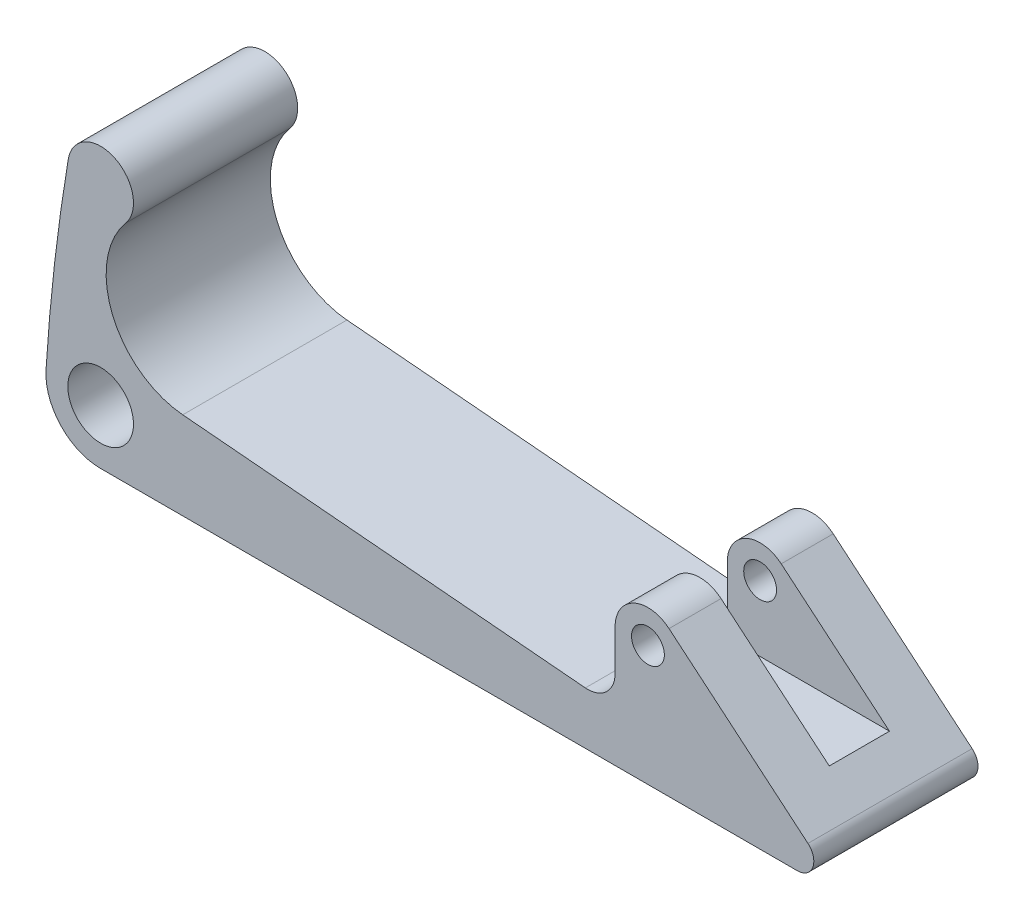
ISO-10303-21;
HEADER;
FILE_DESCRIPTION(('STEP AP214'),'2;1');
FILE_NAME('part.step','',(''),(''),'','','');
FILE_SCHEMA(('AUTOMOTIVE_DESIGN { 1 0 10303 214 1 1 1 1 }'));
ENDSEC;
DATA;
#1=APPLICATION_CONTEXT('core data for automotive mechanical design processes');
#2=APPLICATION_PROTOCOL_DEFINITION('international standard','automotive_design',2000,#1);
#3=PRODUCT_CONTEXT('',#1,'mechanical');
#4=PRODUCT('Part','Part','',(#3));
#5=PRODUCT_RELATED_PRODUCT_CATEGORY('part','',(#4));
#6=PRODUCT_DEFINITION_FORMATION('','',#4);
#7=PRODUCT_DEFINITION_CONTEXT('part definition',#1,'design');
#8=PRODUCT_DEFINITION('design','',#6,#7);
#9=PRODUCT_DEFINITION_SHAPE('','',#8);
#10=(LENGTH_UNIT() NAMED_UNIT(*) SI_UNIT(.MILLI.,.METRE.));
#11=(NAMED_UNIT(*) PLANE_ANGLE_UNIT() SI_UNIT($,.RADIAN.));
#12=(NAMED_UNIT(*) SI_UNIT($,.STERADIAN.) SOLID_ANGLE_UNIT());
#13=UNCERTAINTY_MEASURE_WITH_UNIT(LENGTH_MEASURE(1.E-05),#10,'distance_accuracy_value','');
#14=(GEOMETRIC_REPRESENTATION_CONTEXT(3) GLOBAL_UNCERTAINTY_ASSIGNED_CONTEXT((#13)) GLOBAL_UNIT_ASSIGNED_CONTEXT((#10,
#11,#12)) REPRESENTATION_CONTEXT('',''));
#15=CARTESIAN_POINT('',(0.,0.,0.));
#16=DIRECTION('',(0.,0.,1.));
#17=DIRECTION('',(1.,0.,0.));
#18=AXIS2_PLACEMENT_3D('',#15,#16,#17);
#19=CARTESIAN_POINT('',(64.6194262844656,-2.35093333532153,7.5));
#20=DIRECTION('',(-0.642787609686535,-0.766044443118982,0.));
#21=DIRECTION('',(0.766044443118982,-0.642787609686535,0.));
#22=AXIS2_PLACEMENT_3D('',#19,#20,#21);
#23=PLANE('',#22);
#24=DIRECTION('',(-0.766044443118982,0.642787609686535,0.));
#25=VECTOR('',#24,1.);
#26=CARTESIAN_POINT('',(41.4326190039493,17.1051081019381,2.75));
#27=LINE('',#26,#25);
#28=CARTESIAN_POINT('',(61.8176930361466,0.,2.75));
#29=VERTEX_POINT('',#28);
#30=CARTESIAN_POINT('',(51.9283628290596,8.29813332935695,2.75));
#31=VERTEX_POINT('',#30);
#32=EDGE_CURVE('E284',#29,#31,#27,.T.);
#33=ORIENTED_EDGE('',*,*,#32,.T.);
#34=DIRECTION('',(0.,0.,-1.));
#35=VECTOR('',#34,1.);
#36=CARTESIAN_POINT('',(51.9283628290596,8.29813332935695,7.5));
#37=LINE('',#36,#35);
#38=CARTESIAN_POINT('',(51.9283628290596,8.29813332935695,7.5));
#39=VERTEX_POINT('',#38);
#40=EDGE_CURVE('E200',#39,#31,#37,.T.);
#41=ORIENTED_EDGE('',*,*,#40,.F.);
#42=DIRECTION('',(-0.766044443118982,0.642787609686535,0.));
#43=VECTOR('',#42,1.);
#44=CARTESIAN_POINT('',(64.6194262844656,-2.35093333532153,7.5));
#45=LINE('',#44,#43);
#46=CARTESIAN_POINT('',(64.6194262844656,-2.35093333532153,7.5));
#47=VERTEX_POINT('',#46);
#48=EDGE_CURVE('E231',#47,#39,#45,.T.);
#49=ORIENTED_EDGE('',*,*,#48,.F.);
#50=DIRECTION('',(0.,0.,-1.));
#51=VECTOR('',#50,1.);
#52=CARTESIAN_POINT('',(64.6194262844656,-2.35093333532153,7.5));
#53=LINE('',#52,#51);
#54=CARTESIAN_POINT('',(64.6194262844656,-2.35093333532153,-7.5));
#55=VERTEX_POINT('',#54);
#56=EDGE_CURVE('E203',#47,#55,#53,.T.);
#57=ORIENTED_EDGE('',*,*,#56,.T.);
#58=DIRECTION('',(-0.766044443118982,0.642787609686535,0.));
#59=VECTOR('',#58,1.);
#60=CARTESIAN_POINT('',(64.6194262844656,-2.35093333532153,-7.5));
#61=LINE('',#60,#59);
#62=CARTESIAN_POINT('',(51.9283628290596,8.29813332935695,-7.5));
#63=VERTEX_POINT('',#62);
#64=EDGE_CURVE('E172',#55,#63,#61,.T.);
#65=ORIENTED_EDGE('',*,*,#64,.T.);
#66=CARTESIAN_POINT('',(51.9283628290596,8.29813332935695,-2.75));
#67=VERTEX_POINT('',#66);
#68=EDGE_CURVE('E199',#67,#63,#37,.T.);
#69=ORIENTED_EDGE('',*,*,#68,.F.);
#70=DIRECTION('',(-0.766044443118982,0.642787609686535,0.));
#71=VECTOR('',#70,1.);
#72=CARTESIAN_POINT('',(41.4326190039493,17.1051081019381,-2.75));
#73=LINE('',#72,#71);
#74=CARTESIAN_POINT('',(61.8176930361466,0.,-2.75));
#75=VERTEX_POINT('',#74);
#76=EDGE_CURVE('E301',#75,#67,#73,.T.);
#77=ORIENTED_EDGE('',*,*,#76,.F.);
#78=DIRECTION('',(0.,0.,1.));
#79=VECTOR('',#78,1.);
#80=CARTESIAN_POINT('',(61.8176930361466,0.,0.));
#81=LINE('',#80,#79);
#82=EDGE_CURVE('E280',#75,#29,#81,.T.);
#83=ORIENTED_EDGE('',*,*,#82,.T.);
#84=EDGE_LOOP('',(#33,#41,#49,#57,#65,#69,#77,#83));
#85=FACE_BOUND('',#84,.T.);
#86=ADVANCED_FACE('F35',(#85),#23,.F.);
#87=CARTESIAN_POINT('',(50.,6.,7.5));
#88=DIRECTION('',(0.,0.,-1.));
#89=DIRECTION('',(-1.,0.,0.));
#90=AXIS2_PLACEMENT_3D('',#87,#88,#89);
#91=CYLINDRICAL_SURFACE('',#90,3.);
#92=CARTESIAN_POINT('',(50.,6.,2.75));
#93=DIRECTION('',(0.,0.,-1.));
#94=DIRECTION('',(-1.,0.,0.));
#95=AXIS2_PLACEMENT_3D('',#92,#93,#94);
#96=CIRCLE('',#95,3.);
#97=CARTESIAN_POINT('',(47.,6.,2.75));
#98=VERTEX_POINT('',#97);
#99=EDGE_CURVE('E294',#31,#98,#96,.F.);
#100=ORIENTED_EDGE('',*,*,#99,.T.);
#101=DIRECTION('',(0.,0.,-1.));
#102=VECTOR('',#101,1.);
#103=CARTESIAN_POINT('',(47.,6.,7.5));
#104=LINE('',#103,#102);
#105=CARTESIAN_POINT('',(47.,6.,7.5));
#106=VERTEX_POINT('',#105);
#107=EDGE_CURVE('E196',#106,#98,#104,.T.);
#108=ORIENTED_EDGE('',*,*,#107,.F.);
#109=CARTESIAN_POINT('',(50.,6.,7.5));
#110=DIRECTION('',(0.,0.,1.));
#111=DIRECTION('',(1.,0.,0.));
#112=AXIS2_PLACEMENT_3D('',#109,#110,#111);
#113=CIRCLE('',#112,3.);
#114=EDGE_CURVE('E233',#39,#106,#113,.T.);
#115=ORIENTED_EDGE('',*,*,#114,.F.);
#116=ORIENTED_EDGE('',*,*,#40,.T.);
#117=EDGE_LOOP('',(#100,#108,#115,#116));
#118=FACE_BOUND('',#117,.T.);
#119=ADVANCED_FACE('F331',(#118),#91,.T.);
#120=CARTESIAN_POINT('',(47.,6.,7.5));
#121=DIRECTION('',(1.,0.,0.));
#122=DIRECTION('',(0.,1.,0.));
#123=AXIS2_PLACEMENT_3D('',#120,#121,#122);
#124=PLANE('',#123);
#125=DIRECTION('',(0.,-1.,0.));
#126=VECTOR('',#125,1.);
#127=CARTESIAN_POINT('',(47.,20.501,2.75));
#128=LINE('',#127,#126);
#129=CARTESIAN_POINT('',(47.,2.27246904339944,2.75));
#130=VERTEX_POINT('',#129);
#131=EDGE_CURVE('E249',#98,#130,#128,.T.);
#132=ORIENTED_EDGE('',*,*,#131,.T.);
#133=DIRECTION('',(0.,0.,-1.));
#134=VECTOR('',#133,1.);
#135=CARTESIAN_POINT('',(47.,2.27246904339944,7.5));
#136=LINE('',#135,#134);
#137=CARTESIAN_POINT('',(47.,2.27246904339944,7.5));
#138=VERTEX_POINT('',#137);
#139=EDGE_CURVE('E192',#138,#130,#136,.T.);
#140=ORIENTED_EDGE('',*,*,#139,.F.);
#141=DIRECTION('',(0.,-1.,0.));
#142=VECTOR('',#141,1.);
#143=CARTESIAN_POINT('',(47.,6.,7.5));
#144=LINE('',#143,#142);
#145=EDGE_CURVE('E236',#106,#138,#144,.T.);
#146=ORIENTED_EDGE('',*,*,#145,.F.);
#147=ORIENTED_EDGE('',*,*,#107,.T.);
#148=EDGE_LOOP('',(#132,#140,#146,#147));
#149=FACE_BOUND('',#148,.T.);
#150=ADVANCED_FACE('F246',(#149),#124,.F.);
#151=CARTESIAN_POINT('',(44.5,2.27246904339944,7.5));
#152=DIRECTION('',(0.,0.,-1.));
#153=DIRECTION('',(-1.,0.,0.));
#154=AXIS2_PLACEMENT_3D('',#151,#152,#153);
#155=CYLINDRICAL_SURFACE('',#154,2.5);
#156=CARTESIAN_POINT('',(44.5,2.27246904339944,2.75));
#157=DIRECTION('',(0.,0.,-1.));
#158=DIRECTION('',(-1.,0.,0.));
#159=AXIS2_PLACEMENT_3D('',#156,#157,#158);
#160=CIRCLE('',#159,2.5);
#161=CARTESIAN_POINT('',(45.5420577943623,0.,2.75));
#162=VERTEX_POINT('',#161);
#163=EDGE_CURVE('E304',#130,#162,#160,.T.);
#164=ORIENTED_EDGE('',*,*,#163,.T.);
#165=DIRECTION('',(0.,0.,-1.));
#166=VECTOR('',#165,1.);
#167=CARTESIAN_POINT('',(45.5420577943623,0.,7.5));
#168=LINE('',#167,#166);
#169=CARTESIAN_POINT('',(45.5420577943623,0.,-2.75));
#170=VERTEX_POINT('',#169);
#171=EDGE_CURVE('E287',#162,#170,#168,.T.);
#172=ORIENTED_EDGE('',*,*,#171,.T.);
#173=CARTESIAN_POINT('',(44.5,2.27246904339944,-2.75));
#174=DIRECTION('',(0.,0.,-1.));
#175=DIRECTION('',(-1.,0.,0.));
#176=AXIS2_PLACEMENT_3D('',#173,#174,#175);
#177=CIRCLE('',#176,2.5);
#178=CARTESIAN_POINT('',(47.,2.27246904339944,-2.75));
#179=VERTEX_POINT('',#178);
#180=EDGE_CURVE('E306',#179,#170,#177,.T.);
#181=ORIENTED_EDGE('',*,*,#180,.F.);
#182=CARTESIAN_POINT('',(47.,2.27246904339944,-7.5));
#183=VERTEX_POINT('',#182);
#184=EDGE_CURVE('E191',#179,#183,#136,.T.);
#185=ORIENTED_EDGE('',*,*,#184,.T.);
#186=CARTESIAN_POINT('',(44.5,2.27246904339944,-7.5));
#187=DIRECTION('',(0.,0.,-1.));
#188=DIRECTION('',(-1.,0.,0.));
#189=AXIS2_PLACEMENT_3D('',#186,#187,#188);
#190=CIRCLE('',#189,2.5);
#191=CARTESIAN_POINT('',(44.2821106431309,-0.21801770182993,-7.5));
#192=VERTEX_POINT('',#191);
#193=EDGE_CURVE('E181',#183,#192,#190,.T.);
#194=ORIENTED_EDGE('',*,*,#193,.T.);
#195=DIRECTION('',(0.,0.,-1.));
#196=VECTOR('',#195,1.);
#197=CARTESIAN_POINT('',(44.2821106431309,-0.21801770182993,7.5));
#198=LINE('',#197,#196);
#199=CARTESIAN_POINT('',(44.2821106431309,-0.21801770182993,7.5));
#200=VERTEX_POINT('',#199);
#201=EDGE_CURVE('E153',#200,#192,#198,.T.);
#202=ORIENTED_EDGE('',*,*,#201,.F.);
#203=CARTESIAN_POINT('',(44.5,2.27246904339944,7.5));
#204=DIRECTION('',(0.,0.,-1.));
#205=DIRECTION('',(-1.,0.,0.));
#206=AXIS2_PLACEMENT_3D('',#203,#204,#205);
#207=CIRCLE('',#206,2.5);
#208=EDGE_CURVE('E141',#138,#200,#207,.T.);
#209=ORIENTED_EDGE('',*,*,#208,.F.);
#210=ORIENTED_EDGE('',*,*,#139,.T.);
#211=EDGE_LOOP('',(#164,#172,#181,#185,#194,#202,#209,#210));
#212=FACE_BOUND('',#211,.T.);
#213=ADVANCED_FACE('F252',(#212),#155,.F.);
#214=CARTESIAN_POINT('',(50.,6.,7.5));
#215=DIRECTION('',(0.,0.,-1.));
#216=DIRECTION('',(-1.,0.,0.));
#217=AXIS2_PLACEMENT_3D('',#214,#215,#216);
#218=CYLINDRICAL_SURFACE('',#217,1.5);
#219=CARTESIAN_POINT('',(50.,6.,7.5));
#220=DIRECTION('',(0.,0.,1.));
#221=DIRECTION('',(1.,0.,0.));
#222=AXIS2_PLACEMENT_3D('',#219,#220,#221);
#223=CIRCLE('',#222,1.5);
#224=CARTESIAN_POINT('',(51.5,6.,7.5));
#225=VERTEX_POINT('',#224);
#226=EDGE_CURVE('E265',#225,#225,#223,.T.);
#227=ORIENTED_EDGE('',*,*,#226,.T.);
#228=EDGE_LOOP('',(#227));
#229=FACE_BOUND('',#228,.T.);
#230=CARTESIAN_POINT('',(50.,6.,2.75));
#231=DIRECTION('',(0.,0.,-1.));
#232=DIRECTION('',(-1.,0.,0.));
#233=AXIS2_PLACEMENT_3D('',#230,#231,#232);
#234=CIRCLE('',#233,1.5);
#235=CARTESIAN_POINT('',(48.5,6.,2.75));
#236=VERTEX_POINT('',#235);
#237=EDGE_CURVE('E271',#236,#236,#234,.F.);
#238=ORIENTED_EDGE('',*,*,#237,.F.);
#239=EDGE_LOOP('',(#238));
#240=FACE_BOUND('',#239,.T.);
#241=ADVANCED_FACE('F374',(#229,#240),#218,.F.);
#242=CARTESIAN_POINT('',(164.683096879914,-10.2214285714286,7.5));
#243=DIRECTION('',(0.,0.,-1.));
#244=DIRECTION('',(-1.,0.,0.));
#245=AXIS2_PLACEMENT_3D('',#242,#243,#244);
#246=PLANE('',#245);
#247=CARTESIAN_POINT('',(164.683096879914,-10.2214285714286,7.5));
#248=DIRECTION('',(0.,0.,1.));
#249=DIRECTION('',(-1.,0.,0.));
#250=AXIS2_PLACEMENT_3D('',#247,#248,#249);
#251=CIRCLE('',#250,170.);
#252=CARTESIAN_POINT('',(-2.95837898586672,17.9979897348161,7.5));
#253=VERTEX_POINT('',#252);
#254=CARTESIAN_POINT('',(-4.9903968751489,0.30974025974026,7.5));
#255=VERTEX_POINT('',#254);
#256=EDGE_CURVE('E187',#253,#255,#251,.T.);
#257=ORIENTED_EDGE('',*,*,#256,.T.);
#258=CARTESIAN_POINT('',(0.,0.,7.5));
#259=DIRECTION('',(0.,0.,1.));
#260=DIRECTION('',(-1.,0.,0.));
#261=AXIS2_PLACEMENT_3D('',#258,#259,#260);
#262=CIRCLE('',#261,4.99999999999999);
#263=CARTESIAN_POINT('',(0.,-5.,7.5));
#264=VERTEX_POINT('',#263);
#265=EDGE_CURVE('E109',#255,#264,#262,.T.);
#266=ORIENTED_EDGE('',*,*,#265,.T.);
#267=DIRECTION('',(1.,0.,0.));
#268=VECTOR('',#267,1.);
#269=CARTESIAN_POINT('',(0.,-5.,7.5));
#270=LINE('',#269,#268);
#271=CARTESIAN_POINT('',(63.6552448699358,-5.,7.5));
#272=VERTEX_POINT('',#271);
#273=EDGE_CURVE('E214',#264,#272,#270,.T.);
#274=ORIENTED_EDGE('',*,*,#273,.T.);
#275=CARTESIAN_POINT('',(63.6552448699358,-3.5,7.5));
#276=DIRECTION('',(0.,0.,1.));
#277=DIRECTION('',(1.,0.,0.));
#278=AXIS2_PLACEMENT_3D('',#275,#276,#277);
#279=CIRCLE('',#278,1.5);
#280=EDGE_CURVE('E234',#272,#47,#279,.T.);
#281=ORIENTED_EDGE('',*,*,#280,.T.);
#282=ORIENTED_EDGE('',*,*,#48,.T.);
#283=ORIENTED_EDGE('',*,*,#114,.T.);
#284=ORIENTED_EDGE('',*,*,#145,.T.);
#285=ORIENTED_EDGE('',*,*,#208,.T.);
#286=DIRECTION('',(-0.996194698091746,0.0871557427476513,0.));
#287=VECTOR('',#286,1.);
#288=CARTESIAN_POINT('',(44.2821106431309,-0.21801770182993,7.5));
#289=LINE('',#288,#287);
#290=CARTESIAN_POINT('',(7.5,3.,7.5));
#291=VERTEX_POINT('',#290);
#292=EDGE_CURVE('E133',#200,#291,#289,.T.);
#293=ORIENTED_EDGE('',*,*,#292,.T.);
#294=CARTESIAN_POINT('',(8.16828647845811,10.6385494020051,7.5));
#295=DIRECTION('',(0.,0.,-1.));
#296=DIRECTION('',(1.,0.,0.));
#297=AXIS2_PLACEMENT_3D('',#294,#295,#296);
#298=CIRCLE('',#297,7.66772741978754);
#299=CARTESIAN_POINT('',(2.29710213535456,15.5704089086676,7.5));
#300=VERTEX_POINT('',#299);
#301=EDGE_CURVE('E138',#291,#300,#298,.T.);
#302=ORIENTED_EDGE('',*,*,#301,.T.);
#303=CARTESIAN_POINT('',(0.,17.5,7.5));
#304=DIRECTION('',(0.,0.,1.));
#305=DIRECTION('',(-1.,0.,0.));
#306=AXIS2_PLACEMENT_3D('',#303,#304,#305);
#307=CIRCLE('',#306,2.99999999999999);
#308=EDGE_CURVE('E59',#300,#253,#307,.T.);
#309=ORIENTED_EDGE('',*,*,#308,.T.);
#310=EDGE_LOOP('',(#257,#266,#274,#281,#282,#283,#284,#285,#293,#302,#309));
#311=FACE_BOUND('',#310,.T.);
#312=CARTESIAN_POINT('',(0.,0.,7.5));
#313=DIRECTION('',(0.,0.,1.));
#314=DIRECTION('',(1.,0.,0.));
#315=AXIS2_PLACEMENT_3D('',#312,#313,#314);
#316=CIRCLE('',#315,3.);
#317=CARTESIAN_POINT('',(3.,0.,7.5));
#318=VERTEX_POINT('',#317);
#319=EDGE_CURVE('E166',#318,#318,#316,.T.);
#320=ORIENTED_EDGE('',*,*,#319,.F.);
#321=EDGE_LOOP('',(#320));
#322=FACE_BOUND('',#321,.T.);
#323=ORIENTED_EDGE('',*,*,#226,.F.);
#324=EDGE_LOOP('',(#323));
#325=FACE_BOUND('',#324,.T.);
#326=ADVANCED_FACE('F135',(#311,#322,#325),#246,.F.);
#327=CARTESIAN_POINT('',(164.683096879914,-10.2214285714286,-7.5));
#328=DIRECTION('',(0.,0.,-1.));
#329=DIRECTION('',(-1.,0.,0.));
#330=AXIS2_PLACEMENT_3D('',#327,#328,#329);
#331=PLANE('',#330);
#332=CARTESIAN_POINT('',(0.,0.,-7.5));
#333=DIRECTION('',(0.,0.,1.));
#334=DIRECTION('',(1.,0.,0.));
#335=AXIS2_PLACEMENT_3D('',#332,#333,#334);
#336=CIRCLE('',#335,3.);
#337=CARTESIAN_POINT('',(3.,0.,-7.5));
#338=VERTEX_POINT('',#337);
#339=EDGE_CURVE('E262',#338,#338,#336,.T.);
#340=ORIENTED_EDGE('',*,*,#339,.T.);
#341=EDGE_LOOP('',(#340));
#342=FACE_BOUND('',#341,.T.);
#343=CARTESIAN_POINT('',(164.683096879914,-10.2214285714286,-7.5));
#344=DIRECTION('',(0.,0.,1.));
#345=DIRECTION('',(-1.,0.,0.));
#346=AXIS2_PLACEMENT_3D('',#343,#344,#345);
#347=CIRCLE('',#346,170.);
#348=CARTESIAN_POINT('',(-2.95837898586672,17.9979897348161,-7.5));
#349=VERTEX_POINT('',#348);
#350=CARTESIAN_POINT('',(-4.9903968751489,0.30974025974026,-7.5));
#351=VERTEX_POINT('',#350);
#352=EDGE_CURVE('E162',#349,#351,#347,.T.);
#353=ORIENTED_EDGE('',*,*,#352,.F.);
#354=CARTESIAN_POINT('',(0.,17.5,-7.5));
#355=DIRECTION('',(0.,0.,1.));
#356=DIRECTION('',(-1.,0.,0.));
#357=AXIS2_PLACEMENT_3D('',#354,#355,#356);
#358=CIRCLE('',#357,2.99999999999999);
#359=CARTESIAN_POINT('',(2.29710213535456,15.5704089086676,-7.5));
#360=VERTEX_POINT('',#359);
#361=EDGE_CURVE('E101',#360,#349,#358,.T.);
#362=ORIENTED_EDGE('',*,*,#361,.F.);
#363=CARTESIAN_POINT('',(8.16828647845811,10.6385494020051,-7.5));
#364=DIRECTION('',(0.,0.,-1.));
#365=DIRECTION('',(1.,0.,0.));
#366=AXIS2_PLACEMENT_3D('',#363,#364,#365);
#367=CIRCLE('',#366,7.66772741978754);
#368=CARTESIAN_POINT('',(7.5,3.,-7.5));
#369=VERTEX_POINT('',#368);
#370=EDGE_CURVE('E184',#369,#360,#367,.T.);
#371=ORIENTED_EDGE('',*,*,#370,.F.);
#372=DIRECTION('',(-0.996194698091746,0.0871557427476513,0.));
#373=VECTOR('',#372,1.);
#374=CARTESIAN_POINT('',(44.2821106431309,-0.21801770182993,-7.5));
#375=LINE('',#374,#373);
#376=EDGE_CURVE('E150',#192,#369,#375,.T.);
#377=ORIENTED_EDGE('',*,*,#376,.F.);
#378=ORIENTED_EDGE('',*,*,#193,.F.);
#379=DIRECTION('',(0.,-1.,0.));
#380=VECTOR('',#379,1.);
#381=CARTESIAN_POINT('',(47.,6.,-7.5));
#382=LINE('',#381,#380);
#383=CARTESIAN_POINT('',(47.,6.,-7.5));
#384=VERTEX_POINT('',#383);
#385=EDGE_CURVE('E178',#384,#183,#382,.T.);
#386=ORIENTED_EDGE('',*,*,#385,.F.);
#387=CARTESIAN_POINT('',(50.,6.,-7.5));
#388=DIRECTION('',(0.,0.,1.));
#389=DIRECTION('',(1.,0.,0.));
#390=AXIS2_PLACEMENT_3D('',#387,#388,#389);
#391=CIRCLE('',#390,3.);
#392=EDGE_CURVE('E175',#63,#384,#391,.T.);
#393=ORIENTED_EDGE('',*,*,#392,.F.);
#394=ORIENTED_EDGE('',*,*,#64,.F.);
#395=CARTESIAN_POINT('',(63.6552448699358,-3.5,-7.5));
#396=DIRECTION('',(0.,0.,1.));
#397=DIRECTION('',(1.,0.,0.));
#398=AXIS2_PLACEMENT_3D('',#395,#396,#397);
#399=CIRCLE('',#398,1.5);
#400=CARTESIAN_POINT('',(63.6552448699358,-5.,-7.5));
#401=VERTEX_POINT('',#400);
#402=EDGE_CURVE('E170',#401,#55,#399,.T.);
#403=ORIENTED_EDGE('',*,*,#402,.F.);
#404=DIRECTION('',(1.,0.,0.));
#405=VECTOR('',#404,1.);
#406=CARTESIAN_POINT('',(0.,-5.,-7.5));
#407=LINE('',#406,#405);
#408=CARTESIAN_POINT('',(0.,-5.,-7.5));
#409=VERTEX_POINT('',#408);
#410=EDGE_CURVE('E168',#409,#401,#407,.T.);
#411=ORIENTED_EDGE('',*,*,#410,.F.);
#412=CARTESIAN_POINT('',(0.,0.,-7.5));
#413=DIRECTION('',(0.,0.,1.));
#414=DIRECTION('',(-1.,0.,0.));
#415=AXIS2_PLACEMENT_3D('',#412,#413,#414);
#416=CIRCLE('',#415,4.99999999999999);
#417=EDGE_CURVE('E165',#351,#409,#416,.T.);
#418=ORIENTED_EDGE('',*,*,#417,.F.);
#419=EDGE_LOOP('',(#353,#362,#371,#377,#378,#386,#393,#394,#403,#411,#418));
#420=FACE_BOUND('',#419,.T.);
#421=CARTESIAN_POINT('',(50.,6.,-7.5));
#422=DIRECTION('',(0.,0.,1.));
#423=DIRECTION('',(1.,0.,0.));
#424=AXIS2_PLACEMENT_3D('',#421,#422,#423);
#425=CIRCLE('',#424,1.5);
#426=CARTESIAN_POINT('',(51.5,6.,-7.5));
#427=VERTEX_POINT('',#426);
#428=EDGE_CURVE('E268',#427,#427,#425,.T.);
#429=ORIENTED_EDGE('',*,*,#428,.T.);
#430=EDGE_LOOP('',(#429));
#431=FACE_BOUND('',#430,.T.);
#432=ADVANCED_FACE('F218',(#342,#420,#431),#331,.T.);
#433=CARTESIAN_POINT('',(164.683096879914,-10.2214285714286,7.5));
#434=DIRECTION('',(0.,0.,-1.));
#435=DIRECTION('',(-1.,0.,0.));
#436=AXIS2_PLACEMENT_3D('',#433,#434,#435);
#437=CYLINDRICAL_SURFACE('',#436,170.);
#438=ORIENTED_EDGE('',*,*,#352,.T.);
#439=DIRECTION('',(0.,0.,-1.));
#440=VECTOR('',#439,1.);
#441=CARTESIAN_POINT('',(-4.9903968751489,0.30974025974026,7.5));
#442=LINE('',#441,#440);
#443=EDGE_CURVE('E11',#255,#351,#442,.T.);
#444=ORIENTED_EDGE('',*,*,#443,.F.);
#445=ORIENTED_EDGE('',*,*,#256,.F.);
#446=DIRECTION('',(0.,0.,-1.));
#447=VECTOR('',#446,1.);
#448=CARTESIAN_POINT('',(-2.95837898586672,17.9979897348161,7.5));
#449=LINE('',#448,#447);
#450=EDGE_CURVE('E158',#253,#349,#449,.T.);
#451=ORIENTED_EDGE('',*,*,#450,.T.);
#452=EDGE_LOOP('',(#438,#444,#445,#451));
#453=FACE_BOUND('',#452,.T.);
#454=ADVANCED_FACE('F37',(#453),#437,.T.);
#455=CARTESIAN_POINT('',(0.,0.,7.5));
#456=DIRECTION('',(0.,0.,-1.));
#457=DIRECTION('',(-1.,0.,0.));
#458=AXIS2_PLACEMENT_3D('',#455,#456,#457);
#459=CYLINDRICAL_SURFACE('',#458,4.99999999999999);
#460=ORIENTED_EDGE('',*,*,#417,.T.);
#461=DIRECTION('',(0.,0.,-1.));
#462=VECTOR('',#461,1.);
#463=CARTESIAN_POINT('',(0.,-5.,7.5));
#464=LINE('',#463,#462);
#465=EDGE_CURVE('E43',#264,#409,#464,.T.);
#466=ORIENTED_EDGE('',*,*,#465,.F.);
#467=ORIENTED_EDGE('',*,*,#265,.F.);
#468=ORIENTED_EDGE('',*,*,#443,.T.);
#469=EDGE_LOOP('',(#460,#466,#467,#468));
#470=FACE_BOUND('',#469,.T.);
#471=ADVANCED_FACE('F361',(#470),#459,.T.);
#472=CARTESIAN_POINT('',(0.,-5.,7.5));
#473=DIRECTION('',(0.,1.,0.));
#474=DIRECTION('',(-1.,0.,0.));
#475=AXIS2_PLACEMENT_3D('',#472,#473,#474);
#476=PLANE('',#475);
#477=ORIENTED_EDGE('',*,*,#410,.T.);
#478=DIRECTION('',(0.,0.,-1.));
#479=VECTOR('',#478,1.);
#480=CARTESIAN_POINT('',(63.6552448699358,-5.,7.5));
#481=LINE('',#480,#479);
#482=EDGE_CURVE('E206',#272,#401,#481,.T.);
#483=ORIENTED_EDGE('',*,*,#482,.F.);
#484=ORIENTED_EDGE('',*,*,#273,.F.);
#485=ORIENTED_EDGE('',*,*,#465,.T.);
#486=EDGE_LOOP('',(#477,#483,#484,#485));
#487=FACE_BOUND('',#486,.T.);
#488=ADVANCED_FACE('F212',(#487),#476,.F.);
#489=CARTESIAN_POINT('',(63.6552448699358,-3.5,7.5));
#490=DIRECTION('',(0.,0.,-1.));
#491=DIRECTION('',(-1.,0.,0.));
#492=AXIS2_PLACEMENT_3D('',#489,#490,#491);
#493=CYLINDRICAL_SURFACE('',#492,1.5);
#494=ORIENTED_EDGE('',*,*,#402,.T.);
#495=ORIENTED_EDGE('',*,*,#56,.F.);
#496=ORIENTED_EDGE('',*,*,#280,.F.);
#497=ORIENTED_EDGE('',*,*,#482,.T.);
#498=EDGE_LOOP('',(#494,#495,#496,#497));
#499=FACE_BOUND('',#498,.T.);
#500=ADVANCED_FACE('F224',(#499),#493,.T.);
#501=CARTESIAN_POINT('',(47.,6.,-2.75));
#502=VERTEX_POINT('',#501);
#503=EDGE_CURVE('E195',#502,#384,#104,.T.);
#504=ORIENTED_EDGE('',*,*,#503,.F.);
#505=CARTESIAN_POINT('',(50.,6.,-2.75));
#506=DIRECTION('',(0.,0.,-1.));
#507=DIRECTION('',(-1.,0.,0.));
#508=AXIS2_PLACEMENT_3D('',#505,#506,#507);
#509=CIRCLE('',#508,3.);
#510=EDGE_CURVE('E274',#67,#502,#509,.F.);
#511=ORIENTED_EDGE('',*,*,#510,.F.);
#512=ORIENTED_EDGE('',*,*,#68,.T.);
#513=ORIENTED_EDGE('',*,*,#392,.T.);
#514=EDGE_LOOP('',(#504,#511,#512,#513));
#515=FACE_BOUND('',#514,.T.);
#516=ADVANCED_FACE('F339',(#515),#91,.T.);
#517=ORIENTED_EDGE('',*,*,#184,.F.);
#518=DIRECTION('',(0.,-1.,0.));
#519=VECTOR('',#518,1.);
#520=CARTESIAN_POINT('',(47.,20.501,-2.75));
#521=LINE('',#520,#519);
#522=EDGE_CURVE('E277',#502,#179,#521,.T.);
#523=ORIENTED_EDGE('',*,*,#522,.F.);
#524=ORIENTED_EDGE('',*,*,#503,.T.);
#525=ORIENTED_EDGE('',*,*,#385,.T.);
#526=EDGE_LOOP('',(#517,#523,#524,#525));
#527=FACE_BOUND('',#526,.T.);
#528=ADVANCED_FACE('F341',(#527),#124,.F.);
#529=CARTESIAN_POINT('',(44.2821106431309,-0.21801770182993,7.5));
#530=DIRECTION('',(-0.0871557427476513,-0.996194698091746,0.));
#531=DIRECTION('',(0.996194698091746,-0.0871557427476513,0.));
#532=AXIS2_PLACEMENT_3D('',#529,#530,#531);
#533=PLANE('',#532);
#534=ORIENTED_EDGE('',*,*,#376,.T.);
#535=DIRECTION('',(0.,0.,-1.));
#536=VECTOR('',#535,1.);
#537=CARTESIAN_POINT('',(7.5,3.,7.5));
#538=LINE('',#537,#536);
#539=EDGE_CURVE('E147',#291,#369,#538,.T.);
#540=ORIENTED_EDGE('',*,*,#539,.F.);
#541=ORIENTED_EDGE('',*,*,#292,.F.);
#542=ORIENTED_EDGE('',*,*,#201,.T.);
#543=EDGE_LOOP('',(#534,#540,#541,#542));
#544=FACE_BOUND('',#543,.T.);
#545=ADVANCED_FACE('F148',(#544),#533,.F.);
#546=CARTESIAN_POINT('',(8.16828647845811,10.6385494020051,7.5));
#547=DIRECTION('',(0.,0.,-1.));
#548=DIRECTION('',(-1.,0.,0.));
#549=AXIS2_PLACEMENT_3D('',#546,#547,#548);
#550=CYLINDRICAL_SURFACE('',#549,7.66772741978754);
#551=ORIENTED_EDGE('',*,*,#370,.T.);
#552=DIRECTION('',(0.,0.,-1.));
#553=VECTOR('',#552,1.);
#554=CARTESIAN_POINT('',(2.29710213535456,15.5704089086676,7.5));
#555=LINE('',#554,#553);
#556=EDGE_CURVE('E154',#300,#360,#555,.T.);
#557=ORIENTED_EDGE('',*,*,#556,.F.);
#558=ORIENTED_EDGE('',*,*,#301,.F.);
#559=ORIENTED_EDGE('',*,*,#539,.T.);
#560=EDGE_LOOP('',(#551,#557,#558,#559));
#561=FACE_BOUND('',#560,.T.);
#562=ADVANCED_FACE('F156',(#561),#550,.F.);
#563=CARTESIAN_POINT('',(0.,17.5,7.5));
#564=DIRECTION('',(0.,0.,-1.));
#565=DIRECTION('',(-1.,0.,0.));
#566=AXIS2_PLACEMENT_3D('',#563,#564,#565);
#567=CYLINDRICAL_SURFACE('',#566,2.99999999999999);
#568=ORIENTED_EDGE('',*,*,#361,.T.);
#569=ORIENTED_EDGE('',*,*,#450,.F.);
#570=ORIENTED_EDGE('',*,*,#308,.F.);
#571=ORIENTED_EDGE('',*,*,#556,.T.);
#572=EDGE_LOOP('',(#568,#569,#570,#571));
#573=FACE_BOUND('',#572,.T.);
#574=ADVANCED_FACE('F255',(#573),#567,.T.);
#575=CARTESIAN_POINT('',(0.,0.,7.5));
#576=DIRECTION('',(0.,0.,-1.));
#577=DIRECTION('',(-1.,0.,0.));
#578=AXIS2_PLACEMENT_3D('',#575,#576,#577);
#579=CYLINDRICAL_SURFACE('',#578,3.);
#580=ORIENTED_EDGE('',*,*,#319,.T.);
#581=EDGE_LOOP('',(#580));
#582=FACE_BOUND('',#581,.T.);
#583=ORIENTED_EDGE('',*,*,#339,.F.);
#584=EDGE_LOOP('',(#583));
#585=FACE_BOUND('',#584,.T.);
#586=ADVANCED_FACE('F380',(#582,#585),#579,.F.);
#587=CARTESIAN_POINT('',(50.,6.,-2.75));
#588=DIRECTION('',(0.,0.,-1.));
#589=DIRECTION('',(-1.,0.,0.));
#590=AXIS2_PLACEMENT_3D('',#587,#588,#589);
#591=CIRCLE('',#590,1.5);
#592=CARTESIAN_POINT('',(48.5,6.,-2.75));
#593=VERTEX_POINT('',#592);
#594=EDGE_CURVE('E281',#593,#593,#591,.F.);
#595=ORIENTED_EDGE('',*,*,#594,.T.);
#596=EDGE_LOOP('',(#595));
#597=FACE_BOUND('',#596,.T.);
#598=ORIENTED_EDGE('',*,*,#428,.F.);
#599=EDGE_LOOP('',(#598));
#600=FACE_BOUND('',#599,.T.);
#601=ADVANCED_FACE('F388',(#597,#600),#218,.F.);
#602=CARTESIAN_POINT('',(44.2821106431309,20.501,2.75));
#603=DIRECTION('',(0.,0.,-1.));
#604=DIRECTION('',(-1.,0.,0.));
#605=AXIS2_PLACEMENT_3D('',#602,#603,#604);
#606=PLANE('',#605);
#607=ORIENTED_EDGE('',*,*,#237,.T.);
#608=EDGE_LOOP('',(#607));
#609=FACE_BOUND('',#608,.T.);
#610=DIRECTION('',(1.,0.,0.));
#611=VECTOR('',#610,1.);
#612=CARTESIAN_POINT('',(44.2821106431309,0.,2.75));
#613=LINE('',#612,#611);
#614=EDGE_CURVE('E291',#162,#29,#613,.T.);
#615=ORIENTED_EDGE('',*,*,#614,.F.);
#616=ORIENTED_EDGE('',*,*,#163,.F.);
#617=ORIENTED_EDGE('',*,*,#131,.F.);
#618=ORIENTED_EDGE('',*,*,#99,.F.);
#619=ORIENTED_EDGE('',*,*,#32,.F.);
#620=EDGE_LOOP('',(#615,#616,#617,#618,#619));
#621=FACE_BOUND('',#620,.T.);
#622=ADVANCED_FACE('F324',(#609,#621),#606,.T.);
#623=CARTESIAN_POINT('',(44.2821106431309,20.501,-2.75));
#624=DIRECTION('',(0.,0.,-1.));
#625=DIRECTION('',(-1.,0.,0.));
#626=AXIS2_PLACEMENT_3D('',#623,#624,#625);
#627=PLANE('',#626);
#628=ORIENTED_EDGE('',*,*,#594,.F.);
#629=EDGE_LOOP('',(#628));
#630=FACE_BOUND('',#629,.T.);
#631=ORIENTED_EDGE('',*,*,#76,.T.);
#632=ORIENTED_EDGE('',*,*,#510,.T.);
#633=ORIENTED_EDGE('',*,*,#522,.T.);
#634=ORIENTED_EDGE('',*,*,#180,.T.);
#635=DIRECTION('',(1.,0.,0.));
#636=VECTOR('',#635,1.);
#637=CARTESIAN_POINT('',(44.2821106431309,0.,-2.75));
#638=LINE('',#637,#636);
#639=EDGE_CURVE('E50',#170,#75,#638,.T.);
#640=ORIENTED_EDGE('',*,*,#639,.T.);
#641=EDGE_LOOP('',(#631,#632,#633,#634,#640));
#642=FACE_BOUND('',#641,.T.);
#643=ADVANCED_FACE('F309',(#630,#642),#627,.F.);
#644=CARTESIAN_POINT('',(0.,0.,0.));
#645=DIRECTION('',(0.,1.,0.));
#646=DIRECTION('',(0.,0.,1.));
#647=AXIS2_PLACEMENT_3D('',#644,#645,#646);
#648=PLANE('',#647);
#649=ORIENTED_EDGE('',*,*,#639,.F.);
#650=ORIENTED_EDGE('',*,*,#171,.F.);
#651=ORIENTED_EDGE('',*,*,#614,.T.);
#652=ORIENTED_EDGE('',*,*,#82,.F.);
#653=EDGE_LOOP('',(#649,#650,#651,#652));
#654=FACE_BOUND('',#653,.T.);
#655=ADVANCED_FACE('F318',(#654),#648,.T.);
#656=CLOSED_SHELL('',(#86,#119,#150,#213,#241,#326,#432,#454,#471,#488,#500,#516,#528,#545,#562,
#574,#586,#601,#622,#643,#655));
#657=MANIFOLD_SOLID_BREP('B2',#656);
#658=ADVANCED_BREP_SHAPE_REPRESENTATION('',(#18,#657),#14);
#659=SHAPE_DEFINITION_REPRESENTATION(#9,#658);
ENDSEC;
END-ISO-10303-21;
